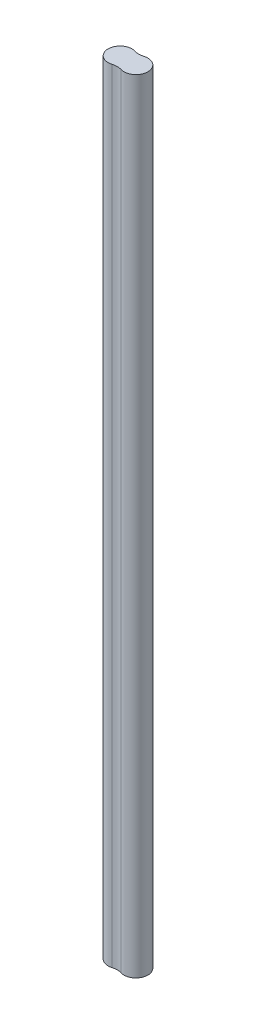
ISO-10303-21;
HEADER;
FILE_DESCRIPTION(('STEP AP214'),'2;1');
FILE_NAME('part.step','',(''),(''),'','','');
FILE_SCHEMA(('AUTOMOTIVE_DESIGN { 1 0 10303 214 1 1 1 1 }'));
ENDSEC;
DATA;
#1=APPLICATION_CONTEXT('core data for automotive mechanical design processes');
#2=APPLICATION_PROTOCOL_DEFINITION('international standard','automotive_design',2000,#1);
#3=PRODUCT_CONTEXT('',#1,'mechanical');
#4=PRODUCT('Part','Part','',(#3));
#5=PRODUCT_RELATED_PRODUCT_CATEGORY('part','',(#4));
#6=PRODUCT_DEFINITION_FORMATION('','',#4);
#7=PRODUCT_DEFINITION_CONTEXT('part definition',#1,'design');
#8=PRODUCT_DEFINITION('design','',#6,#7);
#9=PRODUCT_DEFINITION_SHAPE('','',#8);
#10=(LENGTH_UNIT() NAMED_UNIT(*) SI_UNIT(.MILLI.,.METRE.));
#11=(NAMED_UNIT(*) PLANE_ANGLE_UNIT() SI_UNIT($,.RADIAN.));
#12=(NAMED_UNIT(*) SI_UNIT($,.STERADIAN.) SOLID_ANGLE_UNIT());
#13=UNCERTAINTY_MEASURE_WITH_UNIT(LENGTH_MEASURE(1.E-05),#10,'distance_accuracy_value','');
#14=(GEOMETRIC_REPRESENTATION_CONTEXT(3) GLOBAL_UNCERTAINTY_ASSIGNED_CONTEXT((#13)) GLOBAL_UNIT_ASSIGNED_CONTEXT((#10,
#11,#12)) REPRESENTATION_CONTEXT('',''));
#15=CARTESIAN_POINT('',(0.,0.,0.));
#16=DIRECTION('',(0.,0.,1.));
#17=DIRECTION('',(1.,0.,0.));
#18=AXIS2_PLACEMENT_3D('',#15,#16,#17);
#19=CARTESIAN_POINT('',(2.032,100.,0.));
#20=DIRECTION('',(0.,-1.,0.));
#21=DIRECTION('',(0.,0.,-1.));
#22=AXIS2_PLACEMENT_3D('',#19,#20,#21);
#23=CYLINDRICAL_SURFACE('',#22,1.524);
#24=CARTESIAN_POINT('',(2.032,0.,0.));
#25=DIRECTION('',(0.,1.,0.));
#26=DIRECTION('',(0.,0.,1.));
#27=AXIS2_PLACEMENT_3D('',#24,#25,#26);
#28=CIRCLE('',#27,1.524);
#29=CARTESIAN_POINT('',(1.59261748013621,0.,1.45928715516794));
#30=VERTEX_POINT('',#29);
#31=CARTESIAN_POINT('',(1.59261748013621,0.,-1.45928715516794));
#32=VERTEX_POINT('',#31);
#33=EDGE_CURVE('E97',#30,#32,#28,.T.);
#34=ORIENTED_EDGE('',*,*,#33,.T.);
#35=DIRECTION('',(0.,-1.,0.));
#36=VECTOR('',#35,1.);
#37=CARTESIAN_POINT('',(1.59261748013621,100.,-1.45928715516794));
#38=LINE('',#37,#36);
#39=CARTESIAN_POINT('',(1.59261748013621,100.,-1.45928715516794));
#40=VERTEX_POINT('',#39);
#41=EDGE_CURVE('E50',#32,#40,#38,.F.);
#42=ORIENTED_EDGE('',*,*,#41,.T.);
#43=CARTESIAN_POINT('',(2.032,100.,0.));
#44=DIRECTION('',(0.,1.,0.));
#45=DIRECTION('',(0.,0.,1.));
#46=AXIS2_PLACEMENT_3D('',#43,#44,#45);
#47=CIRCLE('',#46,1.524);
#48=CARTESIAN_POINT('',(1.59261748013621,100.,1.45928715516794));
#49=VERTEX_POINT('',#48);
#50=EDGE_CURVE('E96',#49,#40,#47,.T.);
#51=ORIENTED_EDGE('',*,*,#50,.F.);
#52=DIRECTION('',(0.,-1.,0.));
#53=VECTOR('',#52,1.);
#54=CARTESIAN_POINT('',(1.59261748013621,100.,1.45928715516794));
#55=LINE('',#54,#53);
#56=EDGE_CURVE('E92',#49,#30,#55,.T.);
#57=ORIENTED_EDGE('',*,*,#56,.T.);
#58=EDGE_LOOP('',(#34,#42,#51,#57));
#59=FACE_BOUND('',#58,.T.);
#60=ADVANCED_FACE('F35',(#59),#23,.T.);
#61=CARTESIAN_POINT('',(0.,100.,0.));
#62=DIRECTION('',(0.,-1.,0.));
#63=DIRECTION('',(0.,0.,-1.));
#64=AXIS2_PLACEMENT_3D('',#61,#62,#63);
#65=CYLINDRICAL_SURFACE('',#64,1.524);
#66=CARTESIAN_POINT('',(0.,100.,0.));
#67=DIRECTION('',(0.,1.,0.));
#68=DIRECTION('',(0.,0.,1.));
#69=AXIS2_PLACEMENT_3D('',#66,#67,#68);
#70=CIRCLE('',#69,1.524);
#71=CARTESIAN_POINT('',(0.439382519863791,100.,-1.45928715516794));
#72=VERTEX_POINT('',#71);
#73=CARTESIAN_POINT('',(0.439382519863791,100.,1.45928715516794));
#74=VERTEX_POINT('',#73);
#75=EDGE_CURVE('E91',#72,#74,#70,.T.);
#76=ORIENTED_EDGE('',*,*,#75,.F.);
#77=DIRECTION('',(0.,-1.,0.));
#78=VECTOR('',#77,1.);
#79=CARTESIAN_POINT('',(0.439382519863791,100.,-1.45928715516794));
#80=LINE('',#79,#78);
#81=CARTESIAN_POINT('',(0.439382519863791,0.,-1.45928715516794));
#82=VERTEX_POINT('',#81);
#83=EDGE_CURVE('E79',#72,#82,#80,.T.);
#84=ORIENTED_EDGE('',*,*,#83,.T.);
#85=CARTESIAN_POINT('',(0.,0.,0.));
#86=DIRECTION('',(0.,1.,0.));
#87=DIRECTION('',(0.,0.,1.));
#88=AXIS2_PLACEMENT_3D('',#85,#86,#87);
#89=CIRCLE('',#88,1.524);
#90=CARTESIAN_POINT('',(0.439382519863791,0.,1.45928715516794));
#91=VERTEX_POINT('',#90);
#92=EDGE_CURVE('E89',#82,#91,#89,.T.);
#93=ORIENTED_EDGE('',*,*,#92,.T.);
#94=DIRECTION('',(0.,-1.,0.));
#95=VECTOR('',#94,1.);
#96=CARTESIAN_POINT('',(0.439382519863791,100.,1.45928715516794));
#97=LINE('',#96,#95);
#98=EDGE_CURVE('E93',#91,#74,#97,.F.);
#99=ORIENTED_EDGE('',*,*,#98,.T.);
#100=EDGE_LOOP('',(#76,#84,#93,#99));
#101=FACE_BOUND('',#100,.T.);
#102=ADVANCED_FACE('F88',(#101),#65,.T.);
#103=CARTESIAN_POINT('',(0.,100.,0.));
#104=DIRECTION('',(0.,1.,0.));
#105=DIRECTION('',(0.,0.,1.));
#106=AXIS2_PLACEMENT_3D('',#103,#104,#105);
#107=PLANE('',#106);
#108=ORIENTED_EDGE('',*,*,#75,.T.);
#109=CARTESIAN_POINT('',(1.016,100.,3.37436216195002));
#110=DIRECTION('',(0.,1.,0.));
#111=DIRECTION('',(0.,0.,1.));
#112=AXIS2_PLACEMENT_3D('',#109,#110,#111);
#113=CIRCLE('',#112,2.);
#114=EDGE_CURVE('E11',#74,#49,#113,.F.);
#115=ORIENTED_EDGE('',*,*,#114,.T.);
#116=ORIENTED_EDGE('',*,*,#50,.T.);
#117=CARTESIAN_POINT('',(1.016,100.,-3.37436216195002));
#118=DIRECTION('',(0.,1.,0.));
#119=DIRECTION('',(0.,0.,1.));
#120=AXIS2_PLACEMENT_3D('',#117,#118,#119);
#121=CIRCLE('',#120,2.);
#122=EDGE_CURVE('E83',#40,#72,#121,.F.);
#123=ORIENTED_EDGE('',*,*,#122,.T.);
#124=EDGE_LOOP('',(#108,#115,#116,#123));
#125=FACE_BOUND('',#124,.T.);
#126=ADVANCED_FACE('F107',(#125),#107,.T.);
#127=CARTESIAN_POINT('',(0.,0.,0.));
#128=DIRECTION('',(0.,1.,0.));
#129=DIRECTION('',(0.,0.,1.));
#130=AXIS2_PLACEMENT_3D('',#127,#128,#129);
#131=PLANE('',#130);
#132=ORIENTED_EDGE('',*,*,#33,.F.);
#133=CARTESIAN_POINT('',(1.016,0.,3.37436216195002));
#134=DIRECTION('',(0.,1.,0.));
#135=DIRECTION('',(0.,0.,1.));
#136=AXIS2_PLACEMENT_3D('',#133,#134,#135);
#137=CIRCLE('',#136,2.);
#138=EDGE_CURVE('E43',#30,#91,#137,.T.);
#139=ORIENTED_EDGE('',*,*,#138,.T.);
#140=ORIENTED_EDGE('',*,*,#92,.F.);
#141=CARTESIAN_POINT('',(1.016,0.,-3.37436216195002));
#142=DIRECTION('',(0.,1.,0.));
#143=DIRECTION('',(0.,0.,1.));
#144=AXIS2_PLACEMENT_3D('',#141,#142,#143);
#145=CIRCLE('',#144,2.);
#146=EDGE_CURVE('E75',#82,#32,#145,.T.);
#147=ORIENTED_EDGE('',*,*,#146,.T.);
#148=EDGE_LOOP('',(#132,#139,#140,#147));
#149=FACE_BOUND('',#148,.T.);
#150=ADVANCED_FACE('F95',(#149),#131,.F.);
#151=CARTESIAN_POINT('',(1.016,100.,-3.37436216195002));
#152=DIRECTION('',(0.,1.,0.));
#153=DIRECTION('',(0.,0.,1.));
#154=AXIS2_PLACEMENT_3D('',#151,#152,#153);
#155=CYLINDRICAL_SURFACE('',#154,2.);
#156=ORIENTED_EDGE('',*,*,#122,.F.);
#157=ORIENTED_EDGE('',*,*,#41,.F.);
#158=ORIENTED_EDGE('',*,*,#146,.F.);
#159=ORIENTED_EDGE('',*,*,#83,.F.);
#160=EDGE_LOOP('',(#156,#157,#158,#159));
#161=FACE_BOUND('',#160,.T.);
#162=ADVANCED_FACE('F78',(#161),#155,.F.);
#163=CARTESIAN_POINT('',(1.016,100.,3.37436216195002));
#164=DIRECTION('',(0.,1.,0.));
#165=DIRECTION('',(0.,0.,1.));
#166=AXIS2_PLACEMENT_3D('',#163,#164,#165);
#167=CYLINDRICAL_SURFACE('',#166,2.);
#168=ORIENTED_EDGE('',*,*,#114,.F.);
#169=ORIENTED_EDGE('',*,*,#98,.F.);
#170=ORIENTED_EDGE('',*,*,#138,.F.);
#171=ORIENTED_EDGE('',*,*,#56,.F.);
#172=EDGE_LOOP('',(#168,#169,#170,#171));
#173=FACE_BOUND('',#172,.T.);
#174=ADVANCED_FACE('F37',(#173),#167,.F.);
#175=CLOSED_SHELL('',(#60,#102,#126,#150,#162,#174));
#176=MANIFOLD_SOLID_BREP('B2',#175);
#177=ADVANCED_BREP_SHAPE_REPRESENTATION('',(#18,#176),#14);
#178=SHAPE_DEFINITION_REPRESENTATION(#9,#177);
ENDSEC;
END-ISO-10303-21;
